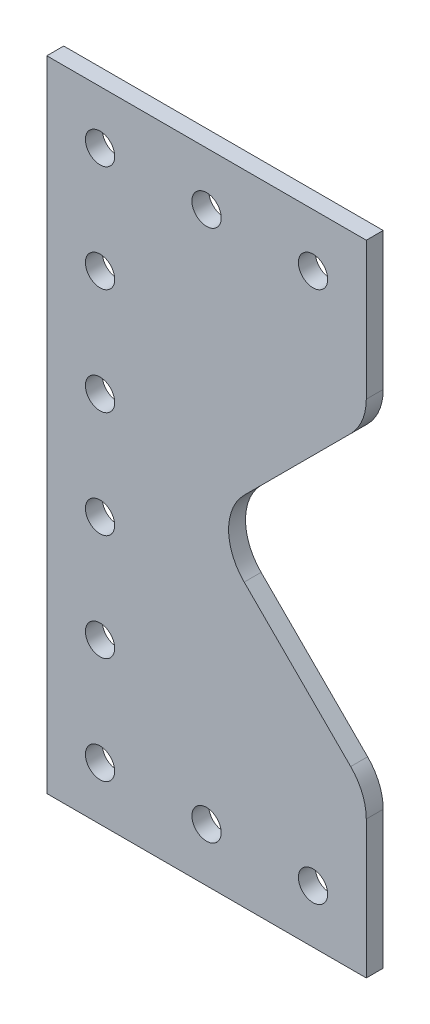
ISO-10303-21;
HEADER;
FILE_DESCRIPTION(('STEP AP214'),'2;1');
FILE_NAME('part.step','',(''),(''),'','','');
FILE_SCHEMA(('AUTOMOTIVE_DESIGN { 1 0 10303 214 1 1 1 1 }'));
ENDSEC;
DATA;
#1=APPLICATION_CONTEXT('core data for automotive mechanical design processes');
#2=APPLICATION_PROTOCOL_DEFINITION('international standard','automotive_design',2000,#1);
#3=PRODUCT_CONTEXT('',#1,'mechanical');
#4=PRODUCT('Part','Part','',(#3));
#5=PRODUCT_RELATED_PRODUCT_CATEGORY('part','',(#4));
#6=PRODUCT_DEFINITION_FORMATION('','',#4);
#7=PRODUCT_DEFINITION_CONTEXT('part definition',#1,'design');
#8=PRODUCT_DEFINITION('design','',#6,#7);
#9=PRODUCT_DEFINITION_SHAPE('','',#8);
#10=(LENGTH_UNIT() NAMED_UNIT(*) SI_UNIT(.MILLI.,.METRE.));
#11=(NAMED_UNIT(*) PLANE_ANGLE_UNIT() SI_UNIT($,.RADIAN.));
#12=(NAMED_UNIT(*) SI_UNIT($,.STERADIAN.) SOLID_ANGLE_UNIT());
#13=UNCERTAINTY_MEASURE_WITH_UNIT(LENGTH_MEASURE(1.E-05),#10,'distance_accuracy_value','');
#14=(GEOMETRIC_REPRESENTATION_CONTEXT(3) GLOBAL_UNCERTAINTY_ASSIGNED_CONTEXT((#13)) GLOBAL_UNIT_ASSIGNED_CONTEXT((#10,
#11,#12)) REPRESENTATION_CONTEXT('',''));
#15=CARTESIAN_POINT('',(0.,0.,0.));
#16=DIRECTION('',(0.,0.,1.));
#17=DIRECTION('',(1.,0.,0.));
#18=AXIS2_PLACEMENT_3D('',#15,#16,#17);
#19=CARTESIAN_POINT('',(0.,0.,0.));
#20=DIRECTION('',(0.,0.,-1.));
#21=DIRECTION('',(-1.,0.,0.));
#22=AXIS2_PLACEMENT_3D('',#19,#20,#21);
#23=PLANE('',#22);
#24=CARTESIAN_POINT('',(10.,110.,0.));
#25=DIRECTION('',(0.,0.,1.));
#26=DIRECTION('',(1.,0.,0.));
#27=AXIS2_PLACEMENT_3D('',#24,#25,#26);
#28=CIRCLE('',#27,2.75);
#29=CARTESIAN_POINT('',(12.75,110.,0.));
#30=VERTEX_POINT('',#29);
#31=EDGE_CURVE('E408',#30,#30,#28,.T.);
#32=ORIENTED_EDGE('',*,*,#31,.T.);
#33=EDGE_LOOP('',(#32));
#34=FACE_BOUND('',#33,.T.);
#35=CARTESIAN_POINT('',(10.,90.,0.));
#36=DIRECTION('',(0.,0.,1.));
#37=DIRECTION('',(1.,0.,0.));
#38=AXIS2_PLACEMENT_3D('',#35,#36,#37);
#39=CIRCLE('',#38,2.75);
#40=CARTESIAN_POINT('',(12.75,90.,0.));
#41=VERTEX_POINT('',#40);
#42=EDGE_CURVE('E413',#41,#41,#39,.T.);
#43=ORIENTED_EDGE('',*,*,#42,.T.);
#44=EDGE_LOOP('',(#43));
#45=FACE_BOUND('',#44,.T.);
#46=DIRECTION('',(-0.707106781186548,0.707106781186548,0.));
#47=VECTOR('',#46,1.);
#48=CARTESIAN_POINT('',(30.,60.,0.));
#49=LINE('',#48,#47);
#50=CARTESIAN_POINT('',(57.0710678118655,32.9289321881345,0.));
#51=VERTEX_POINT('',#50);
#52=CARTESIAN_POINT('',(37.0710678118655,52.9289321881345,0.));
#53=VERTEX_POINT('',#52);
#54=EDGE_CURVE('E168',#51,#53,#49,.T.);
#55=ORIENTED_EDGE('',*,*,#54,.F.);
#56=CARTESIAN_POINT('',(50.,25.857864376269,0.));
#57=DIRECTION('',(0.,0.,-1.));
#58=DIRECTION('',(-1.,0.,0.));
#59=AXIS2_PLACEMENT_3D('',#56,#57,#58);
#60=CIRCLE('',#59,10.);
#61=CARTESIAN_POINT('',(60.,25.857864376269,0.));
#62=VERTEX_POINT('',#61);
#63=EDGE_CURVE('E151',#51,#62,#60,.T.);
#64=ORIENTED_EDGE('',*,*,#63,.T.);
#65=DIRECTION('',(0.,1.,0.));
#66=VECTOR('',#65,1.);
#67=CARTESIAN_POINT('',(60.,30.,0.));
#68=LINE('',#67,#66);
#69=CARTESIAN_POINT('',(60.,0.,0.));
#70=VERTEX_POINT('',#69);
#71=EDGE_CURVE('E178',#70,#62,#68,.T.);
#72=ORIENTED_EDGE('',*,*,#71,.F.);
#73=DIRECTION('',(1.,0.,0.));
#74=VECTOR('',#73,1.);
#75=CARTESIAN_POINT('',(60.,0.,0.));
#76=LINE('',#75,#74);
#77=CARTESIAN_POINT('',(0.,0.,0.));
#78=VERTEX_POINT('',#77);
#79=EDGE_CURVE('E136',#78,#70,#76,.T.);
#80=ORIENTED_EDGE('',*,*,#79,.F.);
#81=DIRECTION('',(0.,-1.,0.));
#82=VECTOR('',#81,1.);
#83=CARTESIAN_POINT('',(0.,0.,0.));
#84=LINE('',#83,#82);
#85=CARTESIAN_POINT('',(0.,120.,0.));
#86=VERTEX_POINT('',#85);
#87=EDGE_CURVE('E132',#86,#78,#84,.T.);
#88=ORIENTED_EDGE('',*,*,#87,.F.);
#89=DIRECTION('',(-1.,0.,0.));
#90=VECTOR('',#89,1.);
#91=CARTESIAN_POINT('',(60.,120.,0.));
#92=LINE('',#91,#90);
#93=CARTESIAN_POINT('',(60.,120.,0.));
#94=VERTEX_POINT('',#93);
#95=EDGE_CURVE('E198',#94,#86,#92,.T.);
#96=ORIENTED_EDGE('',*,*,#95,.F.);
#97=DIRECTION('',(0.,1.,0.));
#98=VECTOR('',#97,1.);
#99=CARTESIAN_POINT('',(60.,90.,0.));
#100=LINE('',#99,#98);
#101=CARTESIAN_POINT('',(60.,94.1421356237309,0.));
#102=VERTEX_POINT('',#101);
#103=EDGE_CURVE('E196',#102,#94,#100,.T.);
#104=ORIENTED_EDGE('',*,*,#103,.F.);
#105=CARTESIAN_POINT('',(50.,94.1421356237309,0.));
#106=DIRECTION('',(0.,0.,-1.));
#107=DIRECTION('',(-1.,0.,0.));
#108=AXIS2_PLACEMENT_3D('',#105,#106,#107);
#109=CIRCLE('',#108,10.);
#110=CARTESIAN_POINT('',(57.0710678118655,87.0710678118655,0.));
#111=VERTEX_POINT('',#110);
#112=EDGE_CURVE('E149',#102,#111,#109,.T.);
#113=ORIENTED_EDGE('',*,*,#112,.T.);
#114=DIRECTION('',(0.707106781186548,0.707106781186548,0.));
#115=VECTOR('',#114,1.);
#116=CARTESIAN_POINT('',(30.,60.,0.));
#117=LINE('',#116,#115);
#118=CARTESIAN_POINT('',(37.0710678118655,67.0710678118655,0.));
#119=VERTEX_POINT('',#118);
#120=EDGE_CURVE('E169',#119,#111,#117,.T.);
#121=ORIENTED_EDGE('',*,*,#120,.F.);
#122=CARTESIAN_POINT('',(44.142135623731,60.,0.));
#123=DIRECTION('',(0.,0.,-1.));
#124=DIRECTION('',(-1.,0.,0.));
#125=AXIS2_PLACEMENT_3D('',#122,#123,#124);
#126=CIRCLE('',#125,10.);
#127=EDGE_CURVE('E41',#119,#53,#126,.F.);
#128=ORIENTED_EDGE('',*,*,#127,.T.);
#129=EDGE_LOOP('',(#55,#64,#72,#80,#88,#96,#104,#113,#121,#128));
#130=FACE_BOUND('',#129,.T.);
#131=CARTESIAN_POINT('',(10.,10.,0.));
#132=DIRECTION('',(0.,0.,1.));
#133=DIRECTION('',(1.,0.,0.));
#134=AXIS2_PLACEMENT_3D('',#131,#132,#133);
#135=CIRCLE('',#134,2.75);
#136=CARTESIAN_POINT('',(12.75,10.,0.));
#137=VERTEX_POINT('',#136);
#138=EDGE_CURVE('E193',#137,#137,#135,.T.);
#139=ORIENTED_EDGE('',*,*,#138,.T.);
#140=EDGE_LOOP('',(#139));
#141=FACE_BOUND('',#140,.T.);
#142=CARTESIAN_POINT('',(30.,10.,0.));
#143=DIRECTION('',(0.,0.,1.));
#144=DIRECTION('',(1.,0.,0.));
#145=AXIS2_PLACEMENT_3D('',#142,#143,#144);
#146=CIRCLE('',#145,2.75);
#147=CARTESIAN_POINT('',(32.75,10.,0.));
#148=VERTEX_POINT('',#147);
#149=EDGE_CURVE('E443',#148,#148,#146,.T.);
#150=ORIENTED_EDGE('',*,*,#149,.T.);
#151=EDGE_LOOP('',(#150));
#152=FACE_BOUND('',#151,.T.);
#153=CARTESIAN_POINT('',(50.,9.99999999999999,0.));
#154=DIRECTION('',(0.,0.,1.));
#155=DIRECTION('',(1.,0.,0.));
#156=AXIS2_PLACEMENT_3D('',#153,#154,#155);
#157=CIRCLE('',#156,2.75);
#158=CARTESIAN_POINT('',(52.75,9.99999999999999,0.));
#159=VERTEX_POINT('',#158);
#160=EDGE_CURVE('E437',#159,#159,#157,.T.);
#161=ORIENTED_EDGE('',*,*,#160,.T.);
#162=EDGE_LOOP('',(#161));
#163=FACE_BOUND('',#162,.T.);
#164=CARTESIAN_POINT('',(10.,30.,0.));
#165=DIRECTION('',(0.,0.,1.));
#166=DIRECTION('',(1.,0.,0.));
#167=AXIS2_PLACEMENT_3D('',#164,#165,#166);
#168=CIRCLE('',#167,2.75);
#169=CARTESIAN_POINT('',(12.75,30.,0.));
#170=VERTEX_POINT('',#169);
#171=EDGE_CURVE('E431',#170,#170,#168,.T.);
#172=ORIENTED_EDGE('',*,*,#171,.T.);
#173=EDGE_LOOP('',(#172));
#174=FACE_BOUND('',#173,.T.);
#175=CARTESIAN_POINT('',(10.,50.,0.));
#176=DIRECTION('',(0.,0.,1.));
#177=DIRECTION('',(1.,0.,0.));
#178=AXIS2_PLACEMENT_3D('',#175,#176,#177);
#179=CIRCLE('',#178,2.75);
#180=CARTESIAN_POINT('',(12.75,50.,0.));
#181=VERTEX_POINT('',#180);
#182=EDGE_CURVE('E425',#181,#181,#179,.T.);
#183=ORIENTED_EDGE('',*,*,#182,.T.);
#184=EDGE_LOOP('',(#183));
#185=FACE_BOUND('',#184,.T.);
#186=CARTESIAN_POINT('',(10.,70.,0.));
#187=DIRECTION('',(0.,0.,1.));
#188=DIRECTION('',(1.,0.,0.));
#189=AXIS2_PLACEMENT_3D('',#186,#187,#188);
#190=CIRCLE('',#189,2.75);
#191=CARTESIAN_POINT('',(12.75,70.,0.));
#192=VERTEX_POINT('',#191);
#193=EDGE_CURVE('E419',#192,#192,#190,.T.);
#194=ORIENTED_EDGE('',*,*,#193,.T.);
#195=EDGE_LOOP('',(#194));
#196=FACE_BOUND('',#195,.T.);
#197=CARTESIAN_POINT('',(30.,110.,0.));
#198=DIRECTION('',(0.,0.,1.));
#199=DIRECTION('',(1.,0.,0.));
#200=AXIS2_PLACEMENT_3D('',#197,#198,#199);
#201=CIRCLE('',#200,2.75);
#202=CARTESIAN_POINT('',(32.75,110.,0.));
#203=VERTEX_POINT('',#202);
#204=EDGE_CURVE('E402',#203,#203,#201,.T.);
#205=ORIENTED_EDGE('',*,*,#204,.T.);
#206=EDGE_LOOP('',(#205));
#207=FACE_BOUND('',#206,.T.);
#208=CARTESIAN_POINT('',(50.,110.,0.));
#209=DIRECTION('',(0.,0.,1.));
#210=DIRECTION('',(1.,0.,0.));
#211=AXIS2_PLACEMENT_3D('',#208,#209,#210);
#212=CIRCLE('',#211,2.75);
#213=CARTESIAN_POINT('',(52.75,110.,0.));
#214=VERTEX_POINT('',#213);
#215=EDGE_CURVE('E392',#214,#214,#212,.T.);
#216=ORIENTED_EDGE('',*,*,#215,.T.);
#217=EDGE_LOOP('',(#216));
#218=FACE_BOUND('',#217,.T.);
#219=ADVANCED_FACE('F33',(#34,#45,#130,#141,#152,#163,#174,#185,#196,#207,#218),#23,.T.);
#220=CARTESIAN_POINT('',(0.,0.,3.175));
#221=DIRECTION('',(0.,0.,-1.));
#222=DIRECTION('',(-1.,0.,0.));
#223=AXIS2_PLACEMENT_3D('',#220,#221,#222);
#224=PLANE('',#223);
#225=CARTESIAN_POINT('',(50.,110.,3.175));
#226=DIRECTION('',(0.,0.,1.));
#227=DIRECTION('',(1.,0.,0.));
#228=AXIS2_PLACEMENT_3D('',#225,#226,#227);
#229=CIRCLE('',#228,2.74999999999999);
#230=CARTESIAN_POINT('',(52.75,110.,3.175));
#231=VERTEX_POINT('',#230);
#232=EDGE_CURVE('E395',#231,#231,#229,.T.);
#233=ORIENTED_EDGE('',*,*,#232,.F.);
#234=EDGE_LOOP('',(#233));
#235=FACE_BOUND('',#234,.T.);
#236=CARTESIAN_POINT('',(10.,90.,3.175));
#237=DIRECTION('',(0.,0.,1.));
#238=DIRECTION('',(1.,0.,0.));
#239=AXIS2_PLACEMENT_3D('',#236,#237,#238);
#240=CIRCLE('',#239,2.74999999999999);
#241=CARTESIAN_POINT('',(12.75,90.,3.175));
#242=VERTEX_POINT('',#241);
#243=EDGE_CURVE('E410',#242,#242,#240,.T.);
#244=ORIENTED_EDGE('',*,*,#243,.F.);
#245=EDGE_LOOP('',(#244));
#246=FACE_BOUND('',#245,.T.);
#247=CARTESIAN_POINT('',(10.,70.,3.175));
#248=DIRECTION('',(0.,0.,1.));
#249=DIRECTION('',(1.,0.,0.));
#250=AXIS2_PLACEMENT_3D('',#247,#248,#249);
#251=CIRCLE('',#250,2.74999999999999);
#252=CARTESIAN_POINT('',(12.75,70.,3.175));
#253=VERTEX_POINT('',#252);
#254=EDGE_CURVE('E416',#253,#253,#251,.T.);
#255=ORIENTED_EDGE('',*,*,#254,.F.);
#256=EDGE_LOOP('',(#255));
#257=FACE_BOUND('',#256,.T.);
#258=CARTESIAN_POINT('',(10.,50.,3.175));
#259=DIRECTION('',(0.,0.,1.));
#260=DIRECTION('',(1.,0.,0.));
#261=AXIS2_PLACEMENT_3D('',#258,#259,#260);
#262=CIRCLE('',#261,2.74999999999999);
#263=CARTESIAN_POINT('',(12.75,50.,3.175));
#264=VERTEX_POINT('',#263);
#265=EDGE_CURVE('E422',#264,#264,#262,.T.);
#266=ORIENTED_EDGE('',*,*,#265,.F.);
#267=EDGE_LOOP('',(#266));
#268=FACE_BOUND('',#267,.T.);
#269=CARTESIAN_POINT('',(10.,30.,3.175));
#270=DIRECTION('',(0.,0.,1.));
#271=DIRECTION('',(1.,0.,0.));
#272=AXIS2_PLACEMENT_3D('',#269,#270,#271);
#273=CIRCLE('',#272,2.74999999999999);
#274=CARTESIAN_POINT('',(12.75,30.,3.175));
#275=VERTEX_POINT('',#274);
#276=EDGE_CURVE('E428',#275,#275,#273,.T.);
#277=ORIENTED_EDGE('',*,*,#276,.F.);
#278=EDGE_LOOP('',(#277));
#279=FACE_BOUND('',#278,.T.);
#280=CARTESIAN_POINT('',(50.,9.99999999999999,3.175));
#281=DIRECTION('',(0.,0.,1.));
#282=DIRECTION('',(1.,0.,0.));
#283=AXIS2_PLACEMENT_3D('',#280,#281,#282);
#284=CIRCLE('',#283,2.74999999999999);
#285=CARTESIAN_POINT('',(52.75,9.99999999999999,3.175));
#286=VERTEX_POINT('',#285);
#287=EDGE_CURVE('E434',#286,#286,#284,.T.);
#288=ORIENTED_EDGE('',*,*,#287,.F.);
#289=EDGE_LOOP('',(#288));
#290=FACE_BOUND('',#289,.T.);
#291=CARTESIAN_POINT('',(30.,10.,3.175));
#292=DIRECTION('',(0.,0.,1.));
#293=DIRECTION('',(1.,0.,0.));
#294=AXIS2_PLACEMENT_3D('',#291,#292,#293);
#295=CIRCLE('',#294,2.74999999999999);
#296=CARTESIAN_POINT('',(32.75,10.,3.175));
#297=VERTEX_POINT('',#296);
#298=EDGE_CURVE('E440',#297,#297,#295,.T.);
#299=ORIENTED_EDGE('',*,*,#298,.F.);
#300=EDGE_LOOP('',(#299));
#301=FACE_BOUND('',#300,.T.);
#302=CARTESIAN_POINT('',(10.,10.,3.175));
#303=DIRECTION('',(0.,0.,1.));
#304=DIRECTION('',(1.,0.,0.));
#305=AXIS2_PLACEMENT_3D('',#302,#303,#304);
#306=CIRCLE('',#305,2.74999999999999);
#307=CARTESIAN_POINT('',(12.75,10.,3.175));
#308=VERTEX_POINT('',#307);
#309=EDGE_CURVE('E446',#308,#308,#306,.T.);
#310=ORIENTED_EDGE('',*,*,#309,.F.);
#311=EDGE_LOOP('',(#310));
#312=FACE_BOUND('',#311,.T.);
#313=DIRECTION('',(0.,1.,0.));
#314=VECTOR('',#313,1.);
#315=CARTESIAN_POINT('',(60.,30.,3.175));
#316=LINE('',#315,#314);
#317=CARTESIAN_POINT('',(60.,0.,3.175));
#318=VERTEX_POINT('',#317);
#319=CARTESIAN_POINT('',(60.,25.857864376269,3.175));
#320=VERTEX_POINT('',#319);
#321=EDGE_CURVE('E111',#318,#320,#316,.T.);
#322=ORIENTED_EDGE('',*,*,#321,.T.);
#323=CARTESIAN_POINT('',(50.,25.857864376269,3.175));
#324=DIRECTION('',(0.,0.,-1.));
#325=DIRECTION('',(-1.,0.,0.));
#326=AXIS2_PLACEMENT_3D('',#323,#324,#325);
#327=CIRCLE('',#326,10.);
#328=CARTESIAN_POINT('',(57.0710678118655,32.9289321881345,3.175));
#329=VERTEX_POINT('',#328);
#330=EDGE_CURVE('E155',#320,#329,#327,.F.);
#331=ORIENTED_EDGE('',*,*,#330,.T.);
#332=DIRECTION('',(-0.707106781186548,0.707106781186548,0.));
#333=VECTOR('',#332,1.);
#334=CARTESIAN_POINT('',(30.,60.,3.175));
#335=LINE('',#334,#333);
#336=CARTESIAN_POINT('',(37.0710678118655,52.9289321881345,3.175));
#337=VERTEX_POINT('',#336);
#338=EDGE_CURVE('E121',#329,#337,#335,.T.);
#339=ORIENTED_EDGE('',*,*,#338,.T.);
#340=CARTESIAN_POINT('',(44.142135623731,60.,3.175));
#341=DIRECTION('',(0.,0.,-1.));
#342=DIRECTION('',(-1.,0.,0.));
#343=AXIS2_PLACEMENT_3D('',#340,#341,#342);
#344=CIRCLE('',#343,10.);
#345=CARTESIAN_POINT('',(37.0710678118655,67.0710678118655,3.175));
#346=VERTEX_POINT('',#345);
#347=EDGE_CURVE('E11',#337,#346,#344,.T.);
#348=ORIENTED_EDGE('',*,*,#347,.T.);
#349=DIRECTION('',(0.707106781186548,0.707106781186548,0.));
#350=VECTOR('',#349,1.);
#351=CARTESIAN_POINT('',(30.,60.,3.175));
#352=LINE('',#351,#350);
#353=CARTESIAN_POINT('',(57.0710678118655,87.0710678118655,3.175));
#354=VERTEX_POINT('',#353);
#355=EDGE_CURVE('E181',#346,#354,#352,.T.);
#356=ORIENTED_EDGE('',*,*,#355,.T.);
#357=CARTESIAN_POINT('',(50.,94.1421356237309,3.175));
#358=DIRECTION('',(0.,0.,-1.));
#359=DIRECTION('',(-1.,0.,0.));
#360=AXIS2_PLACEMENT_3D('',#357,#358,#359);
#361=CIRCLE('',#360,10.);
#362=CARTESIAN_POINT('',(60.,94.1421356237309,3.175));
#363=VERTEX_POINT('',#362);
#364=EDGE_CURVE('E48',#354,#363,#361,.F.);
#365=ORIENTED_EDGE('',*,*,#364,.T.);
#366=DIRECTION('',(0.,1.,0.));
#367=VECTOR('',#366,1.);
#368=CARTESIAN_POINT('',(60.,90.,3.175));
#369=LINE('',#368,#367);
#370=CARTESIAN_POINT('',(60.,120.,3.175));
#371=VERTEX_POINT('',#370);
#372=EDGE_CURVE('E183',#363,#371,#369,.T.);
#373=ORIENTED_EDGE('',*,*,#372,.T.);
#374=DIRECTION('',(-1.,0.,0.));
#375=VECTOR('',#374,1.);
#376=CARTESIAN_POINT('',(60.,120.,3.175));
#377=LINE('',#376,#375);
#378=CARTESIAN_POINT('',(0.,120.,3.175));
#379=VERTEX_POINT('',#378);
#380=EDGE_CURVE('E185',#371,#379,#377,.T.);
#381=ORIENTED_EDGE('',*,*,#380,.T.);
#382=DIRECTION('',(0.,-1.,0.));
#383=VECTOR('',#382,1.);
#384=CARTESIAN_POINT('',(0.,0.,3.175));
#385=LINE('',#384,#383);
#386=CARTESIAN_POINT('',(0.,0.,3.175));
#387=VERTEX_POINT('',#386);
#388=EDGE_CURVE('E128',#379,#387,#385,.T.);
#389=ORIENTED_EDGE('',*,*,#388,.T.);
#390=DIRECTION('',(1.,0.,0.));
#391=VECTOR('',#390,1.);
#392=CARTESIAN_POINT('',(60.,0.,3.175));
#393=LINE('',#392,#391);
#394=EDGE_CURVE('E122',#387,#318,#393,.T.);
#395=ORIENTED_EDGE('',*,*,#394,.T.);
#396=EDGE_LOOP('',(#322,#331,#339,#348,#356,#365,#373,#381,#389,#395));
#397=FACE_BOUND('',#396,.T.);
#398=CARTESIAN_POINT('',(10.,110.,3.175));
#399=DIRECTION('',(0.,0.,1.));
#400=DIRECTION('',(1.,0.,0.));
#401=AXIS2_PLACEMENT_3D('',#398,#399,#400);
#402=CIRCLE('',#401,2.74999999999999);
#403=CARTESIAN_POINT('',(12.75,110.,3.175));
#404=VERTEX_POINT('',#403);
#405=EDGE_CURVE('E405',#404,#404,#402,.T.);
#406=ORIENTED_EDGE('',*,*,#405,.F.);
#407=EDGE_LOOP('',(#406));
#408=FACE_BOUND('',#407,.T.);
#409=CARTESIAN_POINT('',(30.,110.,3.175));
#410=DIRECTION('',(0.,0.,1.));
#411=DIRECTION('',(1.,0.,0.));
#412=AXIS2_PLACEMENT_3D('',#409,#410,#411);
#413=CIRCLE('',#412,2.74999999999999);
#414=CARTESIAN_POINT('',(32.75,110.,3.175));
#415=VERTEX_POINT('',#414);
#416=EDGE_CURVE('E397',#415,#415,#413,.T.);
#417=ORIENTED_EDGE('',*,*,#416,.F.);
#418=EDGE_LOOP('',(#417));
#419=FACE_BOUND('',#418,.T.);
#420=ADVANCED_FACE('F125',(#235,#246,#257,#268,#279,#290,#301,#312,#397,#408,#419),#224,.F.);
#421=CARTESIAN_POINT('',(60.,0.,3.175));
#422=DIRECTION('',(0.,1.,0.));
#423=DIRECTION('',(-1.,0.,0.));
#424=AXIS2_PLACEMENT_3D('',#421,#422,#423);
#425=PLANE('',#424);
#426=ORIENTED_EDGE('',*,*,#79,.T.);
#427=DIRECTION('',(0.,0.,-1.));
#428=VECTOR('',#427,1.);
#429=CARTESIAN_POINT('',(60.,0.,3.175));
#430=LINE('',#429,#428);
#431=EDGE_CURVE('E116',#318,#70,#430,.T.);
#432=ORIENTED_EDGE('',*,*,#431,.F.);
#433=ORIENTED_EDGE('',*,*,#394,.F.);
#434=DIRECTION('',(0.,0.,-1.));
#435=VECTOR('',#434,1.);
#436=CARTESIAN_POINT('',(0.,0.,3.175));
#437=LINE('',#436,#435);
#438=EDGE_CURVE('E191',#387,#78,#437,.T.);
#439=ORIENTED_EDGE('',*,*,#438,.T.);
#440=EDGE_LOOP('',(#426,#432,#433,#439));
#441=FACE_BOUND('',#440,.T.);
#442=ADVANCED_FACE('F134',(#441),#425,.F.);
#443=CARTESIAN_POINT('',(60.,30.,3.175));
#444=DIRECTION('',(-1.,0.,0.));
#445=DIRECTION('',(0.,-1.,0.));
#446=AXIS2_PLACEMENT_3D('',#443,#444,#445);
#447=PLANE('',#446);
#448=ORIENTED_EDGE('',*,*,#71,.T.);
#449=DIRECTION('',(0.,0.,-1.));
#450=VECTOR('',#449,1.);
#451=CARTESIAN_POINT('',(60.,25.857864376269,3.175));
#452=LINE('',#451,#450);
#453=EDGE_CURVE('E119',#62,#320,#452,.F.);
#454=ORIENTED_EDGE('',*,*,#453,.T.);
#455=ORIENTED_EDGE('',*,*,#321,.F.);
#456=ORIENTED_EDGE('',*,*,#431,.T.);
#457=EDGE_LOOP('',(#448,#454,#455,#456));
#458=FACE_BOUND('',#457,.T.);
#459=ADVANCED_FACE('F114',(#458),#447,.F.);
#460=CARTESIAN_POINT('',(30.,60.,3.175));
#461=DIRECTION('',(-0.707106781186548,-0.707106781186548,0.));
#462=DIRECTION('',(0.707106781186548,-0.707106781186548,0.));
#463=AXIS2_PLACEMENT_3D('',#460,#461,#462);
#464=PLANE('',#463);
#465=ORIENTED_EDGE('',*,*,#338,.F.);
#466=DIRECTION('',(0.,0.,-1.));
#467=VECTOR('',#466,1.);
#468=CARTESIAN_POINT('',(57.0710678118655,32.9289321881345,3.175));
#469=LINE('',#468,#467);
#470=EDGE_CURVE('E140',#329,#51,#469,.T.);
#471=ORIENTED_EDGE('',*,*,#470,.T.);
#472=ORIENTED_EDGE('',*,*,#54,.T.);
#473=DIRECTION('',(0.,0.,-1.));
#474=VECTOR('',#473,1.);
#475=CARTESIAN_POINT('',(37.0710678118655,52.9289321881345,3.175));
#476=LINE('',#475,#474);
#477=EDGE_CURVE('E137',#53,#337,#476,.F.);
#478=ORIENTED_EDGE('',*,*,#477,.T.);
#479=EDGE_LOOP('',(#465,#471,#472,#478));
#480=FACE_BOUND('',#479,.T.);
#481=ADVANCED_FACE('F175',(#480),#464,.F.);
#482=CARTESIAN_POINT('',(30.,60.,3.175));
#483=DIRECTION('',(-0.707106781186548,0.707106781186548,0.));
#484=DIRECTION('',(-0.707106781186548,-0.707106781186548,0.));
#485=AXIS2_PLACEMENT_3D('',#482,#483,#484);
#486=PLANE('',#485);
#487=ORIENTED_EDGE('',*,*,#120,.T.);
#488=DIRECTION('',(0.,0.,-1.));
#489=VECTOR('',#488,1.);
#490=CARTESIAN_POINT('',(57.0710678118655,87.0710678118655,3.175));
#491=LINE('',#490,#489);
#492=EDGE_CURVE('E56',#111,#354,#491,.F.);
#493=ORIENTED_EDGE('',*,*,#492,.T.);
#494=ORIENTED_EDGE('',*,*,#355,.F.);
#495=DIRECTION('',(0.,0.,-1.));
#496=VECTOR('',#495,1.);
#497=CARTESIAN_POINT('',(37.0710678118655,67.0710678118655,0.));
#498=LINE('',#497,#496);
#499=EDGE_CURVE('E160',#346,#119,#498,.T.);
#500=ORIENTED_EDGE('',*,*,#499,.T.);
#501=EDGE_LOOP('',(#487,#493,#494,#500));
#502=FACE_BOUND('',#501,.T.);
#503=ADVANCED_FACE('F182',(#502),#486,.F.);
#504=CARTESIAN_POINT('',(60.,90.,3.175));
#505=DIRECTION('',(-1.,0.,0.));
#506=DIRECTION('',(0.,-1.,0.));
#507=AXIS2_PLACEMENT_3D('',#504,#505,#506);
#508=PLANE('',#507);
#509=ORIENTED_EDGE('',*,*,#372,.F.);
#510=DIRECTION('',(0.,0.,-1.));
#511=VECTOR('',#510,1.);
#512=CARTESIAN_POINT('',(60.,94.1421356237309,3.175));
#513=LINE('',#512,#511);
#514=EDGE_CURVE('E157',#363,#102,#513,.T.);
#515=ORIENTED_EDGE('',*,*,#514,.T.);
#516=ORIENTED_EDGE('',*,*,#103,.T.);
#517=DIRECTION('',(0.,0.,-1.));
#518=VECTOR('',#517,1.);
#519=CARTESIAN_POINT('',(60.,120.,3.175));
#520=LINE('',#519,#518);
#521=EDGE_CURVE('E138',#371,#94,#520,.T.);
#522=ORIENTED_EDGE('',*,*,#521,.F.);
#523=EDGE_LOOP('',(#509,#515,#516,#522));
#524=FACE_BOUND('',#523,.T.);
#525=ADVANCED_FACE('F243',(#524),#508,.F.);
#526=CARTESIAN_POINT('',(60.,120.,3.175));
#527=DIRECTION('',(0.,-1.,0.));
#528=DIRECTION('',(0.,0.,-1.));
#529=AXIS2_PLACEMENT_3D('',#526,#527,#528);
#530=PLANE('',#529);
#531=ORIENTED_EDGE('',*,*,#95,.T.);
#532=DIRECTION('',(0.,0.,-1.));
#533=VECTOR('',#532,1.);
#534=CARTESIAN_POINT('',(0.,120.,3.175));
#535=LINE('',#534,#533);
#536=EDGE_CURVE('E143',#379,#86,#535,.T.);
#537=ORIENTED_EDGE('',*,*,#536,.F.);
#538=ORIENTED_EDGE('',*,*,#380,.F.);
#539=ORIENTED_EDGE('',*,*,#521,.T.);
#540=EDGE_LOOP('',(#531,#537,#538,#539));
#541=FACE_BOUND('',#540,.T.);
#542=ADVANCED_FACE('F240',(#541),#530,.F.);
#543=CARTESIAN_POINT('',(0.,0.,3.175));
#544=DIRECTION('',(1.,0.,0.));
#545=DIRECTION('',(0.,0.,-1.));
#546=AXIS2_PLACEMENT_3D('',#543,#544,#545);
#547=PLANE('',#546);
#548=ORIENTED_EDGE('',*,*,#87,.T.);
#549=ORIENTED_EDGE('',*,*,#438,.F.);
#550=ORIENTED_EDGE('',*,*,#388,.F.);
#551=ORIENTED_EDGE('',*,*,#536,.T.);
#552=EDGE_LOOP('',(#548,#549,#550,#551));
#553=FACE_BOUND('',#552,.T.);
#554=ADVANCED_FACE('F205',(#553),#547,.F.);
#555=CARTESIAN_POINT('',(10.,10.,3.175));
#556=DIRECTION('',(0.,0.,1.));
#557=DIRECTION('',(1.,0.,0.));
#558=AXIS2_PLACEMENT_3D('',#555,#556,#557);
#559=CYLINDRICAL_SURFACE('',#558,2.74999999999999);
#560=ORIENTED_EDGE('',*,*,#138,.F.);
#561=EDGE_LOOP('',(#560));
#562=FACE_BOUND('',#561,.T.);
#563=ORIENTED_EDGE('',*,*,#309,.T.);
#564=EDGE_LOOP('',(#563));
#565=FACE_BOUND('',#564,.T.);
#566=ADVANCED_FACE('F239',(#562,#565),#559,.F.);
#567=CARTESIAN_POINT('',(30.,10.,3.175));
#568=DIRECTION('',(0.,0.,1.));
#569=DIRECTION('',(1.,0.,0.));
#570=AXIS2_PLACEMENT_3D('',#567,#568,#569);
#571=CYLINDRICAL_SURFACE('',#570,2.75);
#572=ORIENTED_EDGE('',*,*,#149,.F.);
#573=EDGE_LOOP('',(#572));
#574=FACE_BOUND('',#573,.T.);
#575=ORIENTED_EDGE('',*,*,#298,.T.);
#576=EDGE_LOOP('',(#575));
#577=FACE_BOUND('',#576,.T.);
#578=ADVANCED_FACE('F288',(#574,#577),#571,.F.);
#579=CARTESIAN_POINT('',(50.,9.99999999999999,3.175));
#580=DIRECTION('',(0.,0.,1.));
#581=DIRECTION('',(1.,0.,0.));
#582=AXIS2_PLACEMENT_3D('',#579,#580,#581);
#583=CYLINDRICAL_SURFACE('',#582,2.75);
#584=ORIENTED_EDGE('',*,*,#160,.F.);
#585=EDGE_LOOP('',(#584));
#586=FACE_BOUND('',#585,.T.);
#587=ORIENTED_EDGE('',*,*,#287,.T.);
#588=EDGE_LOOP('',(#587));
#589=FACE_BOUND('',#588,.T.);
#590=ADVANCED_FACE('F295',(#586,#589),#583,.F.);
#591=CARTESIAN_POINT('',(10.,30.,3.175));
#592=DIRECTION('',(0.,0.,1.));
#593=DIRECTION('',(1.,0.,0.));
#594=AXIS2_PLACEMENT_3D('',#591,#592,#593);
#595=CYLINDRICAL_SURFACE('',#594,2.74999999999999);
#596=ORIENTED_EDGE('',*,*,#171,.F.);
#597=EDGE_LOOP('',(#596));
#598=FACE_BOUND('',#597,.T.);
#599=ORIENTED_EDGE('',*,*,#276,.T.);
#600=EDGE_LOOP('',(#599));
#601=FACE_BOUND('',#600,.T.);
#602=ADVANCED_FACE('F303',(#598,#601),#595,.F.);
#603=CARTESIAN_POINT('',(10.,50.,3.175));
#604=DIRECTION('',(0.,0.,1.));
#605=DIRECTION('',(1.,0.,0.));
#606=AXIS2_PLACEMENT_3D('',#603,#604,#605);
#607=CYLINDRICAL_SURFACE('',#606,2.74999999999999);
#608=ORIENTED_EDGE('',*,*,#182,.F.);
#609=EDGE_LOOP('',(#608));
#610=FACE_BOUND('',#609,.T.);
#611=ORIENTED_EDGE('',*,*,#265,.T.);
#612=EDGE_LOOP('',(#611));
#613=FACE_BOUND('',#612,.T.);
#614=ADVANCED_FACE('F311',(#610,#613),#607,.F.);
#615=CARTESIAN_POINT('',(10.,70.,3.175));
#616=DIRECTION('',(0.,0.,1.));
#617=DIRECTION('',(1.,0.,0.));
#618=AXIS2_PLACEMENT_3D('',#615,#616,#617);
#619=CYLINDRICAL_SURFACE('',#618,2.74999999999999);
#620=ORIENTED_EDGE('',*,*,#193,.F.);
#621=EDGE_LOOP('',(#620));
#622=FACE_BOUND('',#621,.T.);
#623=ORIENTED_EDGE('',*,*,#254,.T.);
#624=EDGE_LOOP('',(#623));
#625=FACE_BOUND('',#624,.T.);
#626=ADVANCED_FACE('F319',(#622,#625),#619,.F.);
#627=CARTESIAN_POINT('',(10.,90.,3.175));
#628=DIRECTION('',(0.,0.,1.));
#629=DIRECTION('',(1.,0.,0.));
#630=AXIS2_PLACEMENT_3D('',#627,#628,#629);
#631=CYLINDRICAL_SURFACE('',#630,2.74999999999999);
#632=ORIENTED_EDGE('',*,*,#42,.F.);
#633=EDGE_LOOP('',(#632));
#634=FACE_BOUND('',#633,.T.);
#635=ORIENTED_EDGE('',*,*,#243,.T.);
#636=EDGE_LOOP('',(#635));
#637=FACE_BOUND('',#636,.T.);
#638=ADVANCED_FACE('F221',(#634,#637),#631,.F.);
#639=CARTESIAN_POINT('',(10.,110.,3.175));
#640=DIRECTION('',(0.,0.,1.));
#641=DIRECTION('',(1.,0.,0.));
#642=AXIS2_PLACEMENT_3D('',#639,#640,#641);
#643=CYLINDRICAL_SURFACE('',#642,2.74999999999999);
#644=ORIENTED_EDGE('',*,*,#31,.F.);
#645=EDGE_LOOP('',(#644));
#646=FACE_BOUND('',#645,.T.);
#647=ORIENTED_EDGE('',*,*,#405,.T.);
#648=EDGE_LOOP('',(#647));
#649=FACE_BOUND('',#648,.T.);
#650=ADVANCED_FACE('F214',(#646,#649),#643,.F.);
#651=CARTESIAN_POINT('',(50.,25.857864376269,3.175));
#652=DIRECTION('',(0.,0.,-1.));
#653=DIRECTION('',(-1.,0.,0.));
#654=AXIS2_PLACEMENT_3D('',#651,#652,#653);
#655=CYLINDRICAL_SURFACE('',#654,10.);
#656=ORIENTED_EDGE('',*,*,#330,.F.);
#657=ORIENTED_EDGE('',*,*,#453,.F.);
#658=ORIENTED_EDGE('',*,*,#63,.F.);
#659=ORIENTED_EDGE('',*,*,#470,.F.);
#660=EDGE_LOOP('',(#656,#657,#658,#659));
#661=FACE_BOUND('',#660,.T.);
#662=ADVANCED_FACE('F211',(#661),#655,.T.);
#663=CARTESIAN_POINT('',(50.,94.1421356237309,3.175));
#664=DIRECTION('',(0.,0.,-1.));
#665=DIRECTION('',(-1.,0.,0.));
#666=AXIS2_PLACEMENT_3D('',#663,#664,#665);
#667=CYLINDRICAL_SURFACE('',#666,10.);
#668=ORIENTED_EDGE('',*,*,#364,.F.);
#669=ORIENTED_EDGE('',*,*,#492,.F.);
#670=ORIENTED_EDGE('',*,*,#112,.F.);
#671=ORIENTED_EDGE('',*,*,#514,.F.);
#672=EDGE_LOOP('',(#668,#669,#670,#671));
#673=FACE_BOUND('',#672,.T.);
#674=ADVANCED_FACE('F213',(#673),#667,.T.);
#675=CARTESIAN_POINT('',(44.142135623731,60.,3.175));
#676=DIRECTION('',(0.,0.,1.));
#677=DIRECTION('',(1.,0.,0.));
#678=AXIS2_PLACEMENT_3D('',#675,#676,#677);
#679=CYLINDRICAL_SURFACE('',#678,10.);
#680=ORIENTED_EDGE('',*,*,#347,.F.);
#681=ORIENTED_EDGE('',*,*,#477,.F.);
#682=ORIENTED_EDGE('',*,*,#127,.F.);
#683=ORIENTED_EDGE('',*,*,#499,.F.);
#684=EDGE_LOOP('',(#680,#681,#682,#683));
#685=FACE_BOUND('',#684,.T.);
#686=ADVANCED_FACE('F35',(#685),#679,.F.);
#687=CARTESIAN_POINT('',(30.,110.,3.175));
#688=DIRECTION('',(0.,0.,1.));
#689=DIRECTION('',(1.,0.,0.));
#690=AXIS2_PLACEMENT_3D('',#687,#688,#689);
#691=CYLINDRICAL_SURFACE('',#690,2.75);
#692=ORIENTED_EDGE('',*,*,#204,.F.);
#693=EDGE_LOOP('',(#692));
#694=FACE_BOUND('',#693,.T.);
#695=ORIENTED_EDGE('',*,*,#416,.T.);
#696=EDGE_LOOP('',(#695));
#697=FACE_BOUND('',#696,.T.);
#698=ADVANCED_FACE('F359',(#694,#697),#691,.F.);
#699=CARTESIAN_POINT('',(50.,110.,3.175));
#700=DIRECTION('',(0.,0.,1.));
#701=DIRECTION('',(1.,0.,0.));
#702=AXIS2_PLACEMENT_3D('',#699,#700,#701);
#703=CYLINDRICAL_SURFACE('',#702,2.75);
#704=ORIENTED_EDGE('',*,*,#215,.F.);
#705=EDGE_LOOP('',(#704));
#706=FACE_BOUND('',#705,.T.);
#707=ORIENTED_EDGE('',*,*,#232,.T.);
#708=EDGE_LOOP('',(#707));
#709=FACE_BOUND('',#708,.T.);
#710=ADVANCED_FACE('F374',(#706,#709),#703,.F.);
#711=CLOSED_SHELL('',(#219,#420,#442,#459,#481,#503,#525,#542,#554,#566,#578,#590,#602,#614,
#626,#638,#650,#662,#674,#686,#698,#710));
#712=MANIFOLD_SOLID_BREP('B2',#711);
#713=ADVANCED_BREP_SHAPE_REPRESENTATION('',(#18,#712),#14);
#714=SHAPE_DEFINITION_REPRESENTATION(#9,#713);
ENDSEC;
END-ISO-10303-21;
